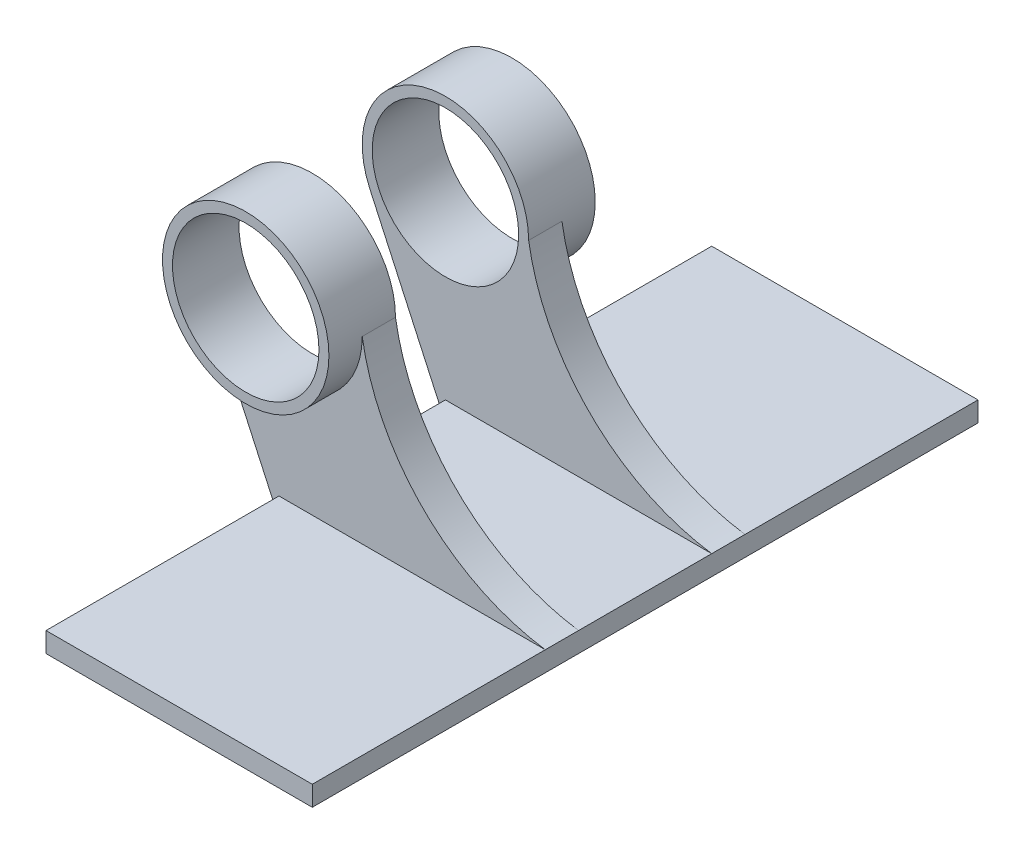
ISO-10303-21;
HEADER;
FILE_DESCRIPTION(('STEP AP214'),'2;1');
FILE_NAME('part.step','',(''),(''),'','','');
FILE_SCHEMA(('AUTOMOTIVE_DESIGN { 1 0 10303 214 1 1 1 1 }'));
ENDSEC;
DATA;
#1=APPLICATION_CONTEXT('core data for automotive mechanical design processes');
#2=APPLICATION_PROTOCOL_DEFINITION('international standard','automotive_design',2000,#1);
#3=PRODUCT_CONTEXT('',#1,'mechanical');
#4=PRODUCT('Part','Part','',(#3));
#5=PRODUCT_RELATED_PRODUCT_CATEGORY('part','',(#4));
#6=PRODUCT_DEFINITION_FORMATION('','',#4);
#7=PRODUCT_DEFINITION_CONTEXT('part definition',#1,'design');
#8=PRODUCT_DEFINITION('design','',#6,#7);
#9=PRODUCT_DEFINITION_SHAPE('','',#8);
#10=(LENGTH_UNIT() NAMED_UNIT(*) SI_UNIT(.MILLI.,.METRE.));
#11=(NAMED_UNIT(*) PLANE_ANGLE_UNIT() SI_UNIT($,.RADIAN.));
#12=(NAMED_UNIT(*) SI_UNIT($,.STERADIAN.) SOLID_ANGLE_UNIT());
#13=UNCERTAINTY_MEASURE_WITH_UNIT(LENGTH_MEASURE(1.E-05),#10,'distance_accuracy_value','');
#14=(GEOMETRIC_REPRESENTATION_CONTEXT(3) GLOBAL_UNCERTAINTY_ASSIGNED_CONTEXT((#13)) GLOBAL_UNIT_ASSIGNED_CONTEXT((#10,
#11,#12)) REPRESENTATION_CONTEXT('',''));
#15=CARTESIAN_POINT('',(0.,0.,0.));
#16=DIRECTION('',(0.,0.,1.));
#17=DIRECTION('',(1.,0.,0.));
#18=AXIS2_PLACEMENT_3D('',#15,#16,#17);
#19=CARTESIAN_POINT('',(0.,0.,-30.));
#20=DIRECTION('',(0.,0.,1.));
#21=DIRECTION('',(-1.,0.,0.));
#22=AXIS2_PLACEMENT_3D('',#19,#20,#21);
#23=CYLINDRICAL_SURFACE('',#22,11.);
#24=CARTESIAN_POINT('',(0.,0.,-30.));
#25=DIRECTION('',(0.,0.,1.));
#26=DIRECTION('',(1.,0.,0.));
#27=AXIS2_PLACEMENT_3D('',#24,#25,#26);
#28=CIRCLE('',#27,11.);
#29=CARTESIAN_POINT('',(11.,0.,-30.));
#30=VERTEX_POINT('',#29);
#31=EDGE_CURVE('E56',#30,#30,#28,.T.);
#32=ORIENTED_EDGE('',*,*,#31,.F.);
#33=EDGE_LOOP('',(#32));
#34=FACE_BOUND('',#33,.T.);
#35=CARTESIAN_POINT('',(0.,0.,-20.));
#36=DIRECTION('',(0.,0.,1.));
#37=DIRECTION('',(1.,0.,0.));
#38=AXIS2_PLACEMENT_3D('',#35,#36,#37);
#39=CIRCLE('',#38,11.);
#40=CARTESIAN_POINT('',(11.,0.,-20.));
#41=VERTEX_POINT('',#40);
#42=EDGE_CURVE('E334',#41,#41,#39,.T.);
#43=ORIENTED_EDGE('',*,*,#42,.T.);
#44=EDGE_LOOP('',(#43));
#45=FACE_BOUND('',#44,.T.);
#46=ADVANCED_FACE('F47',(#34,#45),#23,.F.);
#47=CARTESIAN_POINT('',(0.,0.,-30.));
#48=DIRECTION('',(0.,0.,1.));
#49=DIRECTION('',(-1.,0.,0.));
#50=AXIS2_PLACEMENT_3D('',#47,#48,#49);
#51=CYLINDRICAL_SURFACE('',#50,12.5);
#52=CARTESIAN_POINT('',(0.,0.,-25.));
#53=DIRECTION('',(0.,0.,1.));
#54=DIRECTION('',(1.,0.,0.));
#55=AXIS2_PLACEMENT_3D('',#52,#53,#54);
#56=CIRCLE('',#55,12.5);
#57=CARTESIAN_POINT('',(-11.3632417860789,-5.20833333333333,-25.));
#58=VERTEX_POINT('',#57);
#59=CARTESIAN_POINT('',(12.5,0.,-25.));
#60=VERTEX_POINT('',#59);
#61=EDGE_CURVE('E301',#58,#60,#56,.T.);
#62=ORIENTED_EDGE('',*,*,#61,.F.);
#63=DIRECTION('',(0.,0.,1.));
#64=VECTOR('',#63,1.);
#65=CARTESIAN_POINT('',(-11.3632417860789,-5.20833333333334,-25.));
#66=LINE('',#65,#64);
#67=CARTESIAN_POINT('',(-11.3632417860789,-5.20833333333334,-20.));
#68=VERTEX_POINT('',#67);
#69=EDGE_CURVE('E327',#58,#68,#66,.T.);
#70=ORIENTED_EDGE('',*,*,#69,.T.);
#71=CARTESIAN_POINT('',(0.,0.,-20.));
#72=DIRECTION('',(0.,0.,1.));
#73=DIRECTION('',(1.,0.,0.));
#74=AXIS2_PLACEMENT_3D('',#71,#72,#73);
#75=CIRCLE('',#74,12.5);
#76=CARTESIAN_POINT('',(12.5,0.,-20.));
#77=VERTEX_POINT('',#76);
#78=EDGE_CURVE('E50',#77,#68,#75,.T.);
#79=ORIENTED_EDGE('',*,*,#78,.F.);
#80=DIRECTION('',(0.,0.,1.));
#81=VECTOR('',#80,1.);
#82=CARTESIAN_POINT('',(12.5,0.,-25.));
#83=LINE('',#82,#81);
#84=EDGE_CURVE('E331',#60,#77,#83,.T.);
#85=ORIENTED_EDGE('',*,*,#84,.F.);
#86=EDGE_LOOP('',(#62,#70,#79,#85));
#87=FACE_BOUND('',#86,.T.);
#88=CARTESIAN_POINT('',(0.,0.,-30.));
#89=DIRECTION('',(0.,0.,1.));
#90=DIRECTION('',(1.,0.,0.));
#91=AXIS2_PLACEMENT_3D('',#88,#89,#90);
#92=CIRCLE('',#91,12.5);
#93=CARTESIAN_POINT('',(12.5,0.,-30.));
#94=VERTEX_POINT('',#93);
#95=EDGE_CURVE('E11',#94,#94,#92,.T.);
#96=ORIENTED_EDGE('',*,*,#95,.T.);
#97=EDGE_LOOP('',(#96));
#98=FACE_BOUND('',#97,.T.);
#99=ADVANCED_FACE('F350',(#87,#98),#51,.T.);
#100=CARTESIAN_POINT('',(0.,0.,-30.));
#101=DIRECTION('',(0.,0.,-1.));
#102=DIRECTION('',(1.,0.,0.));
#103=AXIS2_PLACEMENT_3D('',#100,#101,#102);
#104=PLANE('',#103);
#105=ORIENTED_EDGE('',*,*,#31,.T.);
#106=EDGE_LOOP('',(#105));
#107=FACE_BOUND('',#106,.T.);
#108=ORIENTED_EDGE('',*,*,#95,.F.);
#109=EDGE_LOOP('',(#108));
#110=FACE_BOUND('',#109,.T.);
#111=ADVANCED_FACE('F422',(#107,#110),#104,.T.);
#112=CARTESIAN_POINT('',(0.,0.,-20.));
#113=DIRECTION('',(0.,0.,-1.));
#114=DIRECTION('',(1.,0.,0.));
#115=AXIS2_PLACEMENT_3D('',#112,#113,#114);
#116=PLANE('',#115);
#117=ORIENTED_EDGE('',*,*,#42,.F.);
#118=EDGE_LOOP('',(#117));
#119=FACE_BOUND('',#118,.T.);
#120=DIRECTION('',(-0.416666666666667,0.90905934288631,0.));
#121=VECTOR('',#120,1.);
#122=CARTESIAN_POINT('',(-11.3632417860789,-5.20833333333334,-20.));
#123=LINE('',#122,#121);
#124=CARTESIAN_POINT('',(0.,-30.,-20.));
#125=VERTEX_POINT('',#124);
#126=EDGE_CURVE('E302',#125,#68,#123,.T.);
#127=ORIENTED_EDGE('',*,*,#126,.F.);
#128=DIRECTION('',(0.,1.,0.));
#129=VECTOR('',#128,1.);
#130=CARTESIAN_POINT('',(0.,0.,-20.));
#131=LINE('',#130,#129);
#132=CARTESIAN_POINT('',(0.,-27.,-20.));
#133=VERTEX_POINT('',#132);
#134=EDGE_CURVE('E254',#125,#133,#131,.T.);
#135=ORIENTED_EDGE('',*,*,#134,.T.);
#136=DIRECTION('',(-1.,0.,0.));
#137=VECTOR('',#136,1.);
#138=CARTESIAN_POINT('',(0.,-27.,-20.));
#139=LINE('',#138,#137);
#140=CARTESIAN_POINT('',(40.,-27.,-20.));
#141=VERTEX_POINT('',#140);
#142=EDGE_CURVE('E259',#141,#133,#139,.T.);
#143=ORIENTED_EDGE('',*,*,#142,.F.);
#144=CARTESIAN_POINT('',(44.6379609338147,5.22847872888538,-20.));
#145=DIRECTION('',(0.,0.,1.));
#146=DIRECTION('',(1.,0.,0.));
#147=AXIS2_PLACEMENT_3D('',#144,#145,#146);
#148=CIRCLE('',#147,32.5604902113253);
#149=EDGE_CURVE('E298',#77,#141,#148,.T.);
#150=ORIENTED_EDGE('',*,*,#149,.F.);
#151=ORIENTED_EDGE('',*,*,#78,.T.);
#152=EDGE_LOOP('',(#127,#135,#143,#150,#151));
#153=FACE_BOUND('',#152,.T.);
#154=ADVANCED_FACE('F346',(#119,#153),#116,.F.);
#155=CARTESIAN_POINT('',(44.6379609338147,5.22847872888538,-25.));
#156=DIRECTION('',(0.,0.,1.));
#157=DIRECTION('',(-1.,0.,0.));
#158=AXIS2_PLACEMENT_3D('',#155,#156,#157);
#159=CYLINDRICAL_SURFACE('',#158,32.5604902113253);
#160=ORIENTED_EDGE('',*,*,#149,.T.);
#161=DIRECTION('',(0.,0.,1.));
#162=VECTOR('',#161,1.);
#163=CARTESIAN_POINT('',(40.,-27.,-25.));
#164=LINE('',#163,#162);
#165=CARTESIAN_POINT('',(40.,-27.,-25.));
#166=VERTEX_POINT('',#165);
#167=EDGE_CURVE('E315',#166,#141,#164,.T.);
#168=ORIENTED_EDGE('',*,*,#167,.F.);
#169=CARTESIAN_POINT('',(44.6379609338147,5.22847872888538,-25.));
#170=DIRECTION('',(0.,0.,1.));
#171=DIRECTION('',(1.,0.,0.));
#172=AXIS2_PLACEMENT_3D('',#169,#170,#171);
#173=CIRCLE('',#172,32.5604902113253);
#174=EDGE_CURVE('E64',#60,#166,#173,.T.);
#175=ORIENTED_EDGE('',*,*,#174,.F.);
#176=ORIENTED_EDGE('',*,*,#84,.T.);
#177=EDGE_LOOP('',(#160,#168,#175,#176));
#178=FACE_BOUND('',#177,.T.);
#179=ADVANCED_FACE('F372',(#178),#159,.F.);
#180=CARTESIAN_POINT('',(-11.3632417860789,-5.20833333333334,-25.));
#181=DIRECTION('',(-0.90905934288631,-0.416666666666667,0.));
#182=DIRECTION('',(0.416666666666667,-0.90905934288631,0.));
#183=AXIS2_PLACEMENT_3D('',#180,#181,#182);
#184=PLANE('',#183);
#185=ORIENTED_EDGE('',*,*,#126,.T.);
#186=ORIENTED_EDGE('',*,*,#69,.F.);
#187=DIRECTION('',(-0.416666666666667,0.90905934288631,0.));
#188=VECTOR('',#187,1.);
#189=CARTESIAN_POINT('',(-11.3632417860789,-5.20833333333334,-25.));
#190=LINE('',#189,#188);
#191=CARTESIAN_POINT('',(0.,-30.,-25.));
#192=VERTEX_POINT('',#191);
#193=EDGE_CURVE('E72',#192,#58,#190,.T.);
#194=ORIENTED_EDGE('',*,*,#193,.F.);
#195=DIRECTION('',(0.,0.,1.));
#196=VECTOR('',#195,1.);
#197=CARTESIAN_POINT('',(0.,-30.,-25.));
#198=LINE('',#197,#196);
#199=EDGE_CURVE('E324',#192,#125,#198,.T.);
#200=ORIENTED_EDGE('',*,*,#199,.T.);
#201=EDGE_LOOP('',(#185,#186,#194,#200));
#202=FACE_BOUND('',#201,.T.);
#203=ADVANCED_FACE('F353',(#202),#184,.T.);
#204=CARTESIAN_POINT('',(0.,0.,-25.));
#205=DIRECTION('',(0.,0.,-1.));
#206=DIRECTION('',(1.,0.,0.));
#207=AXIS2_PLACEMENT_3D('',#204,#205,#206);
#208=PLANE('',#207);
#209=ORIENTED_EDGE('',*,*,#174,.T.);
#210=DIRECTION('',(-1.,0.,0.));
#211=VECTOR('',#210,1.);
#212=CARTESIAN_POINT('',(0.,-27.,-25.));
#213=LINE('',#212,#211);
#214=CARTESIAN_POINT('',(0.,-27.,-25.));
#215=VERTEX_POINT('',#214);
#216=EDGE_CURVE('E311',#166,#215,#213,.T.);
#217=ORIENTED_EDGE('',*,*,#216,.T.);
#218=DIRECTION('',(0.,1.,0.));
#219=VECTOR('',#218,1.);
#220=CARTESIAN_POINT('',(0.,0.,-25.));
#221=LINE('',#220,#219);
#222=EDGE_CURVE('E307',#192,#215,#221,.T.);
#223=ORIENTED_EDGE('',*,*,#222,.F.);
#224=ORIENTED_EDGE('',*,*,#193,.T.);
#225=ORIENTED_EDGE('',*,*,#61,.T.);
#226=EDGE_LOOP('',(#209,#217,#223,#224,#225));
#227=FACE_BOUND('',#226,.T.);
#228=ADVANCED_FACE('F373',(#227),#208,.T.);
#229=CARTESIAN_POINT('',(0.,0.,-60.));
#230=DIRECTION('',(-1.,0.,0.));
#231=DIRECTION('',(0.,-1.,0.));
#232=AXIS2_PLACEMENT_3D('',#229,#230,#231);
#233=PLANE('',#232);
#234=DIRECTION('',(0.,0.,1.));
#235=VECTOR('',#234,1.);
#236=CARTESIAN_POINT('',(0.,-27.,-60.));
#237=LINE('',#236,#235);
#238=CARTESIAN_POINT('',(0.,-27.,-60.));
#239=VERTEX_POINT('',#238);
#240=EDGE_CURVE('E287',#239,#215,#237,.T.);
#241=ORIENTED_EDGE('',*,*,#240,.F.);
#242=DIRECTION('',(0.,1.,0.));
#243=VECTOR('',#242,1.);
#244=CARTESIAN_POINT('',(0.,0.,-60.));
#245=LINE('',#244,#243);
#246=CARTESIAN_POINT('',(0.,-30.,-60.));
#247=VERTEX_POINT('',#246);
#248=EDGE_CURVE('E266',#247,#239,#245,.T.);
#249=ORIENTED_EDGE('',*,*,#248,.F.);
#250=DIRECTION('',(0.,0.,1.));
#251=VECTOR('',#250,1.);
#252=CARTESIAN_POINT('',(0.,-30.,-60.));
#253=LINE('',#252,#251);
#254=EDGE_CURVE('E295',#247,#192,#253,.T.);
#255=ORIENTED_EDGE('',*,*,#254,.T.);
#256=ORIENTED_EDGE('',*,*,#222,.T.);
#257=EDGE_LOOP('',(#241,#249,#255,#256));
#258=FACE_BOUND('',#257,.T.);
#259=ADVANCED_FACE('F378',(#258),#233,.T.);
#260=CARTESIAN_POINT('',(0.,-30.,-60.));
#261=DIRECTION('',(0.,-1.,0.));
#262=DIRECTION('',(1.,0.,0.));
#263=AXIS2_PLACEMENT_3D('',#260,#261,#262);
#264=PLANE('',#263);
#265=DIRECTION('',(0.,0.,1.));
#266=VECTOR('',#265,1.);
#267=CARTESIAN_POINT('',(40.,-30.,-60.));
#268=LINE('',#267,#266);
#269=CARTESIAN_POINT('',(40.,-30.,-60.));
#270=VERTEX_POINT('',#269);
#271=CARTESIAN_POINT('',(40.,-30.,40.));
#272=VERTEX_POINT('',#271);
#273=EDGE_CURVE('E180',#270,#272,#268,.T.);
#274=ORIENTED_EDGE('',*,*,#273,.T.);
#275=DIRECTION('',(-1.,0.,0.));
#276=VECTOR('',#275,1.);
#277=CARTESIAN_POINT('',(0.,-30.,40.));
#278=LINE('',#277,#276);
#279=CARTESIAN_POINT('',(0.,-30.,40.));
#280=VERTEX_POINT('',#279);
#281=EDGE_CURVE('E171',#272,#280,#278,.T.);
#282=ORIENTED_EDGE('',*,*,#281,.T.);
#283=DIRECTION('',(0.,0.,-1.));
#284=VECTOR('',#283,1.);
#285=CARTESIAN_POINT('',(0.,-30.,40.));
#286=LINE('',#285,#284);
#287=CARTESIAN_POINT('',(0.,-30.,5.));
#288=VERTEX_POINT('',#287);
#289=EDGE_CURVE('E155',#280,#288,#286,.T.);
#290=ORIENTED_EDGE('',*,*,#289,.T.);
#291=DIRECTION('',(0.,0.,-1.));
#292=VECTOR('',#291,1.);
#293=CARTESIAN_POINT('',(0.,-30.,5.));
#294=LINE('',#293,#292);
#295=CARTESIAN_POINT('',(0.,-30.,0.));
#296=VERTEX_POINT('',#295);
#297=EDGE_CURVE('E223',#288,#296,#294,.T.);
#298=ORIENTED_EDGE('',*,*,#297,.T.);
#299=DIRECTION('',(0.,0.,1.));
#300=VECTOR('',#299,1.);
#301=CARTESIAN_POINT('',(0.,-30.,-60.1123422402632));
#302=LINE('',#301,#300);
#303=EDGE_CURVE('E244',#125,#296,#302,.T.);
#304=ORIENTED_EDGE('',*,*,#303,.F.);
#305=ORIENTED_EDGE('',*,*,#199,.F.);
#306=ORIENTED_EDGE('',*,*,#254,.F.);
#307=DIRECTION('',(-1.,0.,0.));
#308=VECTOR('',#307,1.);
#309=CARTESIAN_POINT('',(0.,-30.,-60.));
#310=LINE('',#309,#308);
#311=EDGE_CURVE('E277',#270,#247,#310,.T.);
#312=ORIENTED_EDGE('',*,*,#311,.F.);
#313=EDGE_LOOP('',(#274,#282,#290,#298,#304,#305,#306,#312));
#314=FACE_BOUND('',#313,.T.);
#315=ADVANCED_FACE('F177',(#314),#264,.T.);
#316=CARTESIAN_POINT('',(40.0000000000001,0.,-60.));
#317=DIRECTION('',(-1.,0.,0.));
#318=DIRECTION('',(0.,-1.,0.));
#319=AXIS2_PLACEMENT_3D('',#316,#317,#318);
#320=PLANE('',#319);
#321=ORIENTED_EDGE('',*,*,#167,.T.);
#322=DIRECTION('',(0.,0.,1.));
#323=VECTOR('',#322,1.);
#324=CARTESIAN_POINT('',(40.,-27.,-60.1123422402632));
#325=LINE('',#324,#323);
#326=CARTESIAN_POINT('',(40.,-27.,0.));
#327=VERTEX_POINT('',#326);
#328=EDGE_CURVE('E255',#141,#327,#325,.T.);
#329=ORIENTED_EDGE('',*,*,#328,.T.);
#330=DIRECTION('',(0.,0.,-1.));
#331=VECTOR('',#330,1.);
#332=CARTESIAN_POINT('',(40.,-27.,5.));
#333=LINE('',#332,#331);
#334=CARTESIAN_POINT('',(40.,-27.,5.));
#335=VERTEX_POINT('',#334);
#336=EDGE_CURVE('E213',#335,#327,#333,.T.);
#337=ORIENTED_EDGE('',*,*,#336,.F.);
#338=DIRECTION('',(0.,0.,-1.));
#339=VECTOR('',#338,1.);
#340=CARTESIAN_POINT('',(40.,-27.,40.));
#341=LINE('',#340,#339);
#342=CARTESIAN_POINT('',(40.,-27.,40.));
#343=VERTEX_POINT('',#342);
#344=EDGE_CURVE('E166',#343,#335,#341,.T.);
#345=ORIENTED_EDGE('',*,*,#344,.F.);
#346=DIRECTION('',(0.,1.,0.));
#347=VECTOR('',#346,1.);
#348=CARTESIAN_POINT('',(40.0000000000001,0.,40.));
#349=LINE('',#348,#347);
#350=EDGE_CURVE('E183',#272,#343,#349,.T.);
#351=ORIENTED_EDGE('',*,*,#350,.F.);
#352=ORIENTED_EDGE('',*,*,#273,.F.);
#353=DIRECTION('',(0.,1.,0.));
#354=VECTOR('',#353,1.);
#355=CARTESIAN_POINT('',(40.0000000000001,0.,-60.));
#356=LINE('',#355,#354);
#357=CARTESIAN_POINT('',(40.,-27.,-60.));
#358=VERTEX_POINT('',#357);
#359=EDGE_CURVE('E280',#270,#358,#356,.T.);
#360=ORIENTED_EDGE('',*,*,#359,.T.);
#361=DIRECTION('',(0.,0.,1.));
#362=VECTOR('',#361,1.);
#363=CARTESIAN_POINT('',(40.,-27.,-60.));
#364=LINE('',#363,#362);
#365=EDGE_CURVE('E290',#358,#166,#364,.T.);
#366=ORIENTED_EDGE('',*,*,#365,.T.);
#367=EDGE_LOOP('',(#321,#329,#337,#345,#351,#352,#360,#366));
#368=FACE_BOUND('',#367,.T.);
#369=ADVANCED_FACE('F368',(#368),#320,.F.);
#370=CARTESIAN_POINT('',(0.,-27.,-60.));
#371=DIRECTION('',(0.,-1.,0.));
#372=DIRECTION('',(1.,0.,0.));
#373=AXIS2_PLACEMENT_3D('',#370,#371,#372);
#374=PLANE('',#373);
#375=ORIENTED_EDGE('',*,*,#216,.F.);
#376=ORIENTED_EDGE('',*,*,#365,.F.);
#377=DIRECTION('',(-1.,0.,0.));
#378=VECTOR('',#377,1.);
#379=CARTESIAN_POINT('',(0.,-27.,-60.));
#380=LINE('',#379,#378);
#381=EDGE_CURVE('E284',#358,#239,#380,.T.);
#382=ORIENTED_EDGE('',*,*,#381,.T.);
#383=ORIENTED_EDGE('',*,*,#240,.T.);
#384=EDGE_LOOP('',(#375,#376,#382,#383));
#385=FACE_BOUND('',#384,.T.);
#386=ADVANCED_FACE('F375',(#385),#374,.F.);
#387=CARTESIAN_POINT('',(0.,0.,-60.));
#388=DIRECTION('',(0.,0.,-1.));
#389=DIRECTION('',(1.,0.,0.));
#390=AXIS2_PLACEMENT_3D('',#387,#388,#389);
#391=PLANE('',#390);
#392=ORIENTED_EDGE('',*,*,#248,.T.);
#393=ORIENTED_EDGE('',*,*,#381,.F.);
#394=ORIENTED_EDGE('',*,*,#359,.F.);
#395=ORIENTED_EDGE('',*,*,#311,.T.);
#396=EDGE_LOOP('',(#392,#393,#394,#395));
#397=FACE_BOUND('',#396,.T.);
#398=ADVANCED_FACE('F380',(#397),#391,.T.);
#399=CARTESIAN_POINT('',(0.,0.,-60.1123422402632));
#400=DIRECTION('',(1.,0.,0.));
#401=DIRECTION('',(0.,1.,0.));
#402=AXIS2_PLACEMENT_3D('',#399,#400,#401);
#403=PLANE('',#402);
#404=ORIENTED_EDGE('',*,*,#134,.F.);
#405=ORIENTED_EDGE('',*,*,#303,.T.);
#406=DIRECTION('',(0.,1.,0.));
#407=VECTOR('',#406,1.);
#408=CARTESIAN_POINT('',(0.,0.,0.));
#409=LINE('',#408,#407);
#410=CARTESIAN_POINT('',(0.,-27.,0.));
#411=VERTEX_POINT('',#410);
#412=EDGE_CURVE('E256',#296,#411,#409,.T.);
#413=ORIENTED_EDGE('',*,*,#412,.T.);
#414=DIRECTION('',(0.,0.,1.));
#415=VECTOR('',#414,1.);
#416=CARTESIAN_POINT('',(0.,-27.,-60.1123422402632));
#417=LINE('',#416,#415);
#418=EDGE_CURVE('E263',#133,#411,#417,.T.);
#419=ORIENTED_EDGE('',*,*,#418,.F.);
#420=EDGE_LOOP('',(#404,#405,#413,#419));
#421=FACE_BOUND('',#420,.T.);
#422=ADVANCED_FACE('F361',(#421),#403,.F.);
#423=CARTESIAN_POINT('',(0.,-27.,-60.1123422402632));
#424=DIRECTION('',(0.,1.,0.));
#425=DIRECTION('',(-1.,0.,0.));
#426=AXIS2_PLACEMENT_3D('',#423,#424,#425);
#427=PLANE('',#426);
#428=ORIENTED_EDGE('',*,*,#328,.F.);
#429=ORIENTED_EDGE('',*,*,#142,.T.);
#430=ORIENTED_EDGE('',*,*,#418,.T.);
#431=DIRECTION('',(-1.,0.,0.));
#432=VECTOR('',#431,1.);
#433=CARTESIAN_POINT('',(0.,-27.,0.));
#434=LINE('',#433,#432);
#435=EDGE_CURVE('E250',#327,#411,#434,.T.);
#436=ORIENTED_EDGE('',*,*,#435,.F.);
#437=EDGE_LOOP('',(#428,#429,#430,#436));
#438=FACE_BOUND('',#437,.T.);
#439=ADVANCED_FACE('F364',(#438),#427,.T.);
#440=CARTESIAN_POINT('',(0.,0.,10.));
#441=DIRECTION('',(0.,0.,-1.));
#442=DIRECTION('',(-1.,0.,0.));
#443=AXIS2_PLACEMENT_3D('',#440,#441,#442);
#444=CYLINDRICAL_SURFACE('',#443,11.);
#445=CARTESIAN_POINT('',(0.,0.,10.));
#446=DIRECTION('',(0.,0.,1.));
#447=DIRECTION('',(1.,0.,0.));
#448=AXIS2_PLACEMENT_3D('',#445,#446,#447);
#449=CIRCLE('',#448,11.);
#450=CARTESIAN_POINT('',(11.,0.,10.));
#451=VERTEX_POINT('',#450);
#452=EDGE_CURVE('E235',#451,#451,#449,.T.);
#453=ORIENTED_EDGE('',*,*,#452,.T.);
#454=EDGE_LOOP('',(#453));
#455=FACE_BOUND('',#454,.T.);
#456=CARTESIAN_POINT('',(0.,0.,0.));
#457=DIRECTION('',(0.,0.,1.));
#458=DIRECTION('',(1.,0.,0.));
#459=AXIS2_PLACEMENT_3D('',#456,#457,#458);
#460=CIRCLE('',#459,11.);
#461=CARTESIAN_POINT('',(11.,0.,0.));
#462=VERTEX_POINT('',#461);
#463=EDGE_CURVE('E234',#462,#462,#460,.T.);
#464=ORIENTED_EDGE('',*,*,#463,.F.);
#465=EDGE_LOOP('',(#464));
#466=FACE_BOUND('',#465,.T.);
#467=ADVANCED_FACE('F404',(#455,#466),#444,.F.);
#468=CARTESIAN_POINT('',(0.,0.,10.));
#469=DIRECTION('',(0.,0.,-1.));
#470=DIRECTION('',(-1.,0.,0.));
#471=AXIS2_PLACEMENT_3D('',#468,#469,#470);
#472=CYLINDRICAL_SURFACE('',#471,12.5);
#473=CARTESIAN_POINT('',(0.,0.,5.));
#474=DIRECTION('',(0.,0.,1.));
#475=DIRECTION('',(1.,0.,0.));
#476=AXIS2_PLACEMENT_3D('',#473,#474,#475);
#477=CIRCLE('',#476,12.5);
#478=CARTESIAN_POINT('',(-11.3632417860789,-5.20833333333333,5.));
#479=VERTEX_POINT('',#478);
#480=CARTESIAN_POINT('',(12.5,0.,5.));
#481=VERTEX_POINT('',#480);
#482=EDGE_CURVE('E199',#479,#481,#477,.T.);
#483=ORIENTED_EDGE('',*,*,#482,.T.);
#484=DIRECTION('',(0.,0.,-1.));
#485=VECTOR('',#484,1.);
#486=CARTESIAN_POINT('',(12.5,0.,5.));
#487=LINE('',#486,#485);
#488=CARTESIAN_POINT('',(12.5,0.,0.));
#489=VERTEX_POINT('',#488);
#490=EDGE_CURVE('E230',#481,#489,#487,.T.);
#491=ORIENTED_EDGE('',*,*,#490,.T.);
#492=CARTESIAN_POINT('',(0.,0.,0.));
#493=DIRECTION('',(0.,0.,1.));
#494=DIRECTION('',(1.,0.,0.));
#495=AXIS2_PLACEMENT_3D('',#492,#493,#494);
#496=CIRCLE('',#495,12.5);
#497=CARTESIAN_POINT('',(-11.3632417860789,-5.20833333333334,0.));
#498=VERTEX_POINT('',#497);
#499=EDGE_CURVE('E240',#489,#498,#496,.T.);
#500=ORIENTED_EDGE('',*,*,#499,.T.);
#501=DIRECTION('',(0.,0.,-1.));
#502=VECTOR('',#501,1.);
#503=CARTESIAN_POINT('',(-11.3632417860789,-5.20833333333334,5.));
#504=LINE('',#503,#502);
#505=EDGE_CURVE('E226',#479,#498,#504,.T.);
#506=ORIENTED_EDGE('',*,*,#505,.F.);
#507=EDGE_LOOP('',(#483,#491,#500,#506));
#508=FACE_BOUND('',#507,.T.);
#509=CARTESIAN_POINT('',(0.,0.,10.));
#510=DIRECTION('',(0.,0.,1.));
#511=DIRECTION('',(1.,0.,0.));
#512=AXIS2_PLACEMENT_3D('',#509,#510,#511);
#513=CIRCLE('',#512,12.5);
#514=CARTESIAN_POINT('',(12.5,0.,10.));
#515=VERTEX_POINT('',#514);
#516=EDGE_CURVE('E239',#515,#515,#513,.T.);
#517=ORIENTED_EDGE('',*,*,#516,.F.);
#518=EDGE_LOOP('',(#517));
#519=FACE_BOUND('',#518,.T.);
#520=ADVANCED_FACE('F400',(#508,#519),#472,.T.);
#521=CARTESIAN_POINT('',(0.,0.,10.));
#522=DIRECTION('',(0.,0.,1.));
#523=DIRECTION('',(1.,0.,0.));
#524=AXIS2_PLACEMENT_3D('',#521,#522,#523);
#525=PLANE('',#524);
#526=ORIENTED_EDGE('',*,*,#452,.F.);
#527=EDGE_LOOP('',(#526));
#528=FACE_BOUND('',#527,.T.);
#529=ORIENTED_EDGE('',*,*,#516,.T.);
#530=EDGE_LOOP('',(#529));
#531=FACE_BOUND('',#530,.T.);
#532=ADVANCED_FACE('F403',(#528,#531),#525,.T.);
#533=CARTESIAN_POINT('',(0.,0.,0.));
#534=DIRECTION('',(0.,0.,1.));
#535=DIRECTION('',(1.,0.,0.));
#536=AXIS2_PLACEMENT_3D('',#533,#534,#535);
#537=PLANE('',#536);
#538=ORIENTED_EDGE('',*,*,#412,.F.);
#539=DIRECTION('',(-0.416666666666667,0.90905934288631,0.));
#540=VECTOR('',#539,1.);
#541=CARTESIAN_POINT('',(-11.3632417860789,-5.20833333333334,0.));
#542=LINE('',#541,#540);
#543=EDGE_CURVE('E200',#296,#498,#542,.T.);
#544=ORIENTED_EDGE('',*,*,#543,.T.);
#545=ORIENTED_EDGE('',*,*,#499,.F.);
#546=CARTESIAN_POINT('',(44.6379609338147,5.22847872888538,0.));
#547=DIRECTION('',(0.,0.,1.));
#548=DIRECTION('',(1.,0.,0.));
#549=AXIS2_PLACEMENT_3D('',#546,#547,#548);
#550=CIRCLE('',#549,32.5604902113253);
#551=EDGE_CURVE('E165',#489,#327,#550,.T.);
#552=ORIENTED_EDGE('',*,*,#551,.T.);
#553=ORIENTED_EDGE('',*,*,#435,.T.);
#554=EDGE_LOOP('',(#538,#544,#545,#552,#553));
#555=FACE_BOUND('',#554,.T.);
#556=ORIENTED_EDGE('',*,*,#463,.T.);
#557=EDGE_LOOP('',(#556));
#558=FACE_BOUND('',#557,.T.);
#559=ADVANCED_FACE('F393',(#555,#558),#537,.F.);
#560=CARTESIAN_POINT('',(44.6379609338147,5.22847872888538,5.));
#561=DIRECTION('',(0.,0.,-1.));
#562=DIRECTION('',(-1.,0.,0.));
#563=AXIS2_PLACEMENT_3D('',#560,#561,#562);
#564=CYLINDRICAL_SURFACE('',#563,32.5604902113253);
#565=ORIENTED_EDGE('',*,*,#551,.F.);
#566=ORIENTED_EDGE('',*,*,#490,.F.);
#567=CARTESIAN_POINT('',(44.6379609338147,5.22847872888538,5.));
#568=DIRECTION('',(0.,0.,1.));
#569=DIRECTION('',(1.,0.,0.));
#570=AXIS2_PLACEMENT_3D('',#567,#568,#569);
#571=CIRCLE('',#570,32.5604902113253);
#572=EDGE_CURVE('E196',#481,#335,#571,.T.);
#573=ORIENTED_EDGE('',*,*,#572,.T.);
#574=ORIENTED_EDGE('',*,*,#336,.T.);
#575=EDGE_LOOP('',(#565,#566,#573,#574));
#576=FACE_BOUND('',#575,.T.);
#577=ADVANCED_FACE('F398',(#576),#564,.F.);
#578=CARTESIAN_POINT('',(-11.3632417860789,-5.20833333333334,5.));
#579=DIRECTION('',(-0.90905934288631,-0.416666666666667,0.));
#580=DIRECTION('',(0.416666666666667,-0.90905934288631,0.));
#581=AXIS2_PLACEMENT_3D('',#578,#579,#580);
#582=PLANE('',#581);
#583=ORIENTED_EDGE('',*,*,#543,.F.);
#584=ORIENTED_EDGE('',*,*,#297,.F.);
#585=DIRECTION('',(-0.416666666666667,0.90905934288631,0.));
#586=VECTOR('',#585,1.);
#587=CARTESIAN_POINT('',(-11.3632417860789,-5.20833333333334,5.));
#588=LINE('',#587,#586);
#589=EDGE_CURVE('E203',#288,#479,#588,.T.);
#590=ORIENTED_EDGE('',*,*,#589,.T.);
#591=ORIENTED_EDGE('',*,*,#505,.T.);
#592=EDGE_LOOP('',(#583,#584,#590,#591));
#593=FACE_BOUND('',#592,.T.);
#594=ADVANCED_FACE('F391',(#593),#582,.T.);
#595=CARTESIAN_POINT('',(0.,0.,5.));
#596=DIRECTION('',(0.,0.,1.));
#597=DIRECTION('',(1.,0.,0.));
#598=AXIS2_PLACEMENT_3D('',#595,#596,#597);
#599=PLANE('',#598);
#600=ORIENTED_EDGE('',*,*,#572,.F.);
#601=ORIENTED_EDGE('',*,*,#482,.F.);
#602=ORIENTED_EDGE('',*,*,#589,.F.);
#603=DIRECTION('',(0.,1.,0.));
#604=VECTOR('',#603,1.);
#605=CARTESIAN_POINT('',(0.,0.,5.));
#606=LINE('',#605,#604);
#607=CARTESIAN_POINT('',(0.,-27.,5.));
#608=VERTEX_POINT('',#607);
#609=EDGE_CURVE('E160',#288,#608,#606,.T.);
#610=ORIENTED_EDGE('',*,*,#609,.T.);
#611=DIRECTION('',(-1.,0.,0.));
#612=VECTOR('',#611,1.);
#613=CARTESIAN_POINT('',(0.,-27.,5.));
#614=LINE('',#613,#612);
#615=EDGE_CURVE('E209',#335,#608,#614,.T.);
#616=ORIENTED_EDGE('',*,*,#615,.F.);
#617=EDGE_LOOP('',(#600,#601,#602,#610,#616));
#618=FACE_BOUND('',#617,.T.);
#619=ADVANCED_FACE('F386',(#618),#599,.T.);
#620=CARTESIAN_POINT('',(0.,0.,40.));
#621=DIRECTION('',(-1.,0.,0.));
#622=DIRECTION('',(0.,-1.,0.));
#623=AXIS2_PLACEMENT_3D('',#620,#621,#622);
#624=PLANE('',#623);
#625=DIRECTION('',(0.,0.,-1.));
#626=VECTOR('',#625,1.);
#627=CARTESIAN_POINT('',(0.,-27.,40.));
#628=LINE('',#627,#626);
#629=CARTESIAN_POINT('',(0.,-27.,40.));
#630=VERTEX_POINT('',#629);
#631=EDGE_CURVE('E190',#630,#608,#628,.T.);
#632=ORIENTED_EDGE('',*,*,#631,.T.);
#633=ORIENTED_EDGE('',*,*,#609,.F.);
#634=ORIENTED_EDGE('',*,*,#289,.F.);
#635=DIRECTION('',(0.,1.,0.));
#636=VECTOR('',#635,1.);
#637=CARTESIAN_POINT('',(0.,0.,40.));
#638=LINE('',#637,#636);
#639=EDGE_CURVE('E159',#280,#630,#638,.T.);
#640=ORIENTED_EDGE('',*,*,#639,.T.);
#641=EDGE_LOOP('',(#632,#633,#634,#640));
#642=FACE_BOUND('',#641,.T.);
#643=ADVANCED_FACE('F158',(#642),#624,.T.);
#644=CARTESIAN_POINT('',(0.,-27.,40.));
#645=DIRECTION('',(0.,-1.,0.));
#646=DIRECTION('',(1.,0.,0.));
#647=AXIS2_PLACEMENT_3D('',#644,#645,#646);
#648=PLANE('',#647);
#649=ORIENTED_EDGE('',*,*,#615,.T.);
#650=ORIENTED_EDGE('',*,*,#631,.F.);
#651=DIRECTION('',(-1.,0.,0.));
#652=VECTOR('',#651,1.);
#653=CARTESIAN_POINT('',(0.,-27.,40.));
#654=LINE('',#653,#652);
#655=EDGE_CURVE('E173',#343,#630,#654,.T.);
#656=ORIENTED_EDGE('',*,*,#655,.F.);
#657=ORIENTED_EDGE('',*,*,#344,.T.);
#658=EDGE_LOOP('',(#649,#650,#656,#657));
#659=FACE_BOUND('',#658,.T.);
#660=ADVANCED_FACE('F382',(#659),#648,.F.);
#661=CARTESIAN_POINT('',(0.,0.,40.));
#662=DIRECTION('',(0.,0.,1.));
#663=DIRECTION('',(1.,0.,0.));
#664=AXIS2_PLACEMENT_3D('',#661,#662,#663);
#665=PLANE('',#664);
#666=ORIENTED_EDGE('',*,*,#639,.F.);
#667=ORIENTED_EDGE('',*,*,#281,.F.);
#668=ORIENTED_EDGE('',*,*,#350,.T.);
#669=ORIENTED_EDGE('',*,*,#655,.T.);
#670=EDGE_LOOP('',(#666,#667,#668,#669));
#671=FACE_BOUND('',#670,.T.);
#672=ADVANCED_FACE('F170',(#671),#665,.T.);
#673=CLOSED_SHELL('',(#46,#99,#111,#154,#179,#203,#228,#259,#315,#369,#386,#398,#422,#439,#467,
#520,#532,#559,#577,#594,#619,#643,#660,#672));
#674=MANIFOLD_SOLID_BREP('B2',#673);
#675=ADVANCED_BREP_SHAPE_REPRESENTATION('',(#18,#674),#14);
#676=SHAPE_DEFINITION_REPRESENTATION(#9,#675);
ENDSEC;
END-ISO-10303-21;
